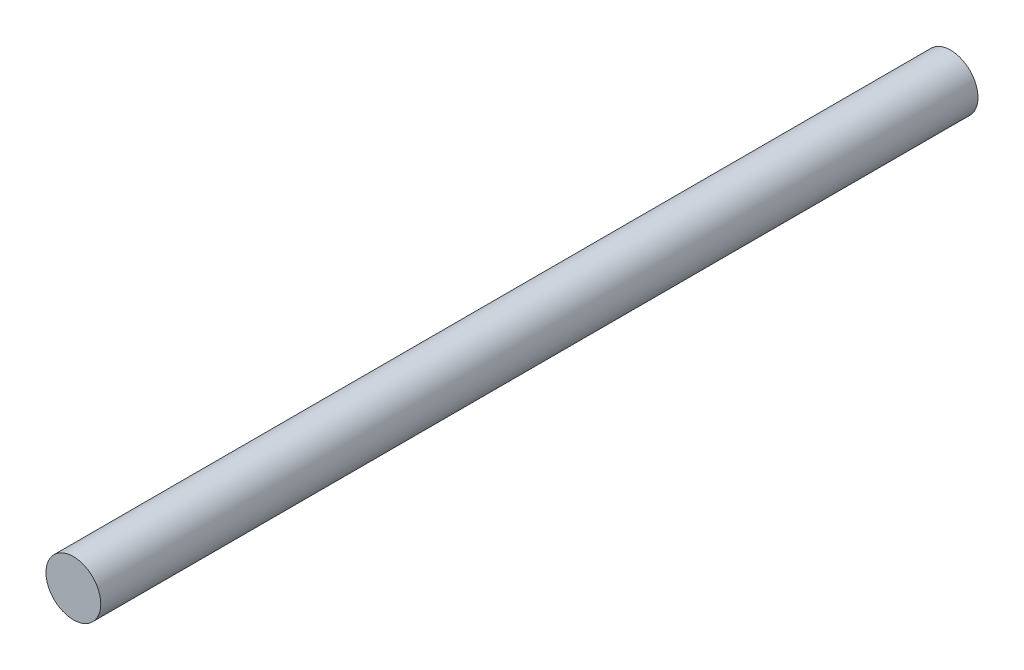
ISO-10303-21;
HEADER;
FILE_DESCRIPTION(('STEP AP214'),'2;1');
FILE_NAME('part.step','',(''),(''),'','','');
FILE_SCHEMA(('AUTOMOTIVE_DESIGN { 1 0 10303 214 1 1 1 1 }'));
ENDSEC;
DATA;
#1=APPLICATION_CONTEXT('core data for automotive mechanical design processes');
#2=APPLICATION_PROTOCOL_DEFINITION('international standard','automotive_design',2000,#1);
#3=PRODUCT_CONTEXT('',#1,'mechanical');
#4=PRODUCT('Part','Part','',(#3));
#5=PRODUCT_RELATED_PRODUCT_CATEGORY('part','',(#4));
#6=PRODUCT_DEFINITION_FORMATION('','',#4);
#7=PRODUCT_DEFINITION_CONTEXT('part definition',#1,'design');
#8=PRODUCT_DEFINITION('design','',#6,#7);
#9=PRODUCT_DEFINITION_SHAPE('','',#8);
#10=(LENGTH_UNIT() NAMED_UNIT(*) SI_UNIT(.MILLI.,.METRE.));
#11=(NAMED_UNIT(*) PLANE_ANGLE_UNIT() SI_UNIT($,.RADIAN.));
#12=(NAMED_UNIT(*) SI_UNIT($,.STERADIAN.) SOLID_ANGLE_UNIT());
#13=UNCERTAINTY_MEASURE_WITH_UNIT(LENGTH_MEASURE(1.E-05),#10,'distance_accuracy_value','');
#14=(GEOMETRIC_REPRESENTATION_CONTEXT(3) GLOBAL_UNCERTAINTY_ASSIGNED_CONTEXT((#13)) GLOBAL_UNIT_ASSIGNED_CONTEXT((#10,
#11,#12)) REPRESENTATION_CONTEXT('',''));
#15=CARTESIAN_POINT('',(0.,0.,0.));
#16=DIRECTION('',(0.,0.,1.));
#17=DIRECTION('',(1.,0.,0.));
#18=AXIS2_PLACEMENT_3D('',#15,#16,#17);
#19=CARTESIAN_POINT('',(-21.5564112527648,3.49008563140001,32.));
#20=DIRECTION('',(0.,0.,-1.));
#21=DIRECTION('',(-1.,0.,0.));
#22=AXIS2_PLACEMENT_3D('',#19,#20,#21);
#23=CYLINDRICAL_SURFACE('',#22,1.);
#24=CARTESIAN_POINT('',(-21.5564112527648,3.49008563140001,32.));
#25=DIRECTION('',(0.,0.,1.));
#26=DIRECTION('',(1.,0.,0.));
#27=AXIS2_PLACEMENT_3D('',#24,#25,#26);
#28=CIRCLE('',#27,1.);
#29=CARTESIAN_POINT('',(-20.5564112527648,3.49008563140001,32.));
#30=VERTEX_POINT('',#29);
#31=EDGE_CURVE('E10',#30,#30,#28,.T.);
#32=ORIENTED_EDGE('',*,*,#31,.F.);
#33=EDGE_LOOP('',(#32));
#34=FACE_BOUND('',#33,.T.);
#35=CARTESIAN_POINT('',(-21.5564112527648,3.49008563140001,0.));
#36=DIRECTION('',(0.,0.,1.));
#37=DIRECTION('',(1.,0.,0.));
#38=AXIS2_PLACEMENT_3D('',#35,#36,#37);
#39=CIRCLE('',#38,1.);
#40=CARTESIAN_POINT('',(-20.5564112527648,3.49008563140001,0.));
#41=VERTEX_POINT('',#40);
#42=EDGE_CURVE('E34',#41,#41,#39,.T.);
#43=ORIENTED_EDGE('',*,*,#42,.T.);
#44=EDGE_LOOP('',(#43));
#45=FACE_BOUND('',#44,.T.);
#46=ADVANCED_FACE('F31',(#34,#45),#23,.T.);
#47=CARTESIAN_POINT('',(-21.5564112527648,3.49008563140001,32.));
#48=DIRECTION('',(0.,0.,1.));
#49=DIRECTION('',(1.,0.,0.));
#50=AXIS2_PLACEMENT_3D('',#47,#48,#49);
#51=PLANE('',#50);
#52=ORIENTED_EDGE('',*,*,#31,.T.);
#53=EDGE_LOOP('',(#52));
#54=FACE_BOUND('',#53,.T.);
#55=ADVANCED_FACE('F46',(#54),#51,.T.);
#56=CARTESIAN_POINT('',(-21.5564112527648,3.49008563140001,0.));
#57=DIRECTION('',(0.,0.,1.));
#58=DIRECTION('',(1.,0.,0.));
#59=AXIS2_PLACEMENT_3D('',#56,#57,#58);
#60=PLANE('',#59);
#61=ORIENTED_EDGE('',*,*,#42,.F.);
#62=EDGE_LOOP('',(#61));
#63=FACE_BOUND('',#62,.T.);
#64=ADVANCED_FACE('F44',(#63),#60,.F.);
#65=CLOSED_SHELL('',(#46,#55,#64));
#66=MANIFOLD_SOLID_BREP('B2',#65);
#67=ADVANCED_BREP_SHAPE_REPRESENTATION('',(#18,#66),#14);
#68=SHAPE_DEFINITION_REPRESENTATION(#9,#67);
ENDSEC;
END-ISO-10303-21;
